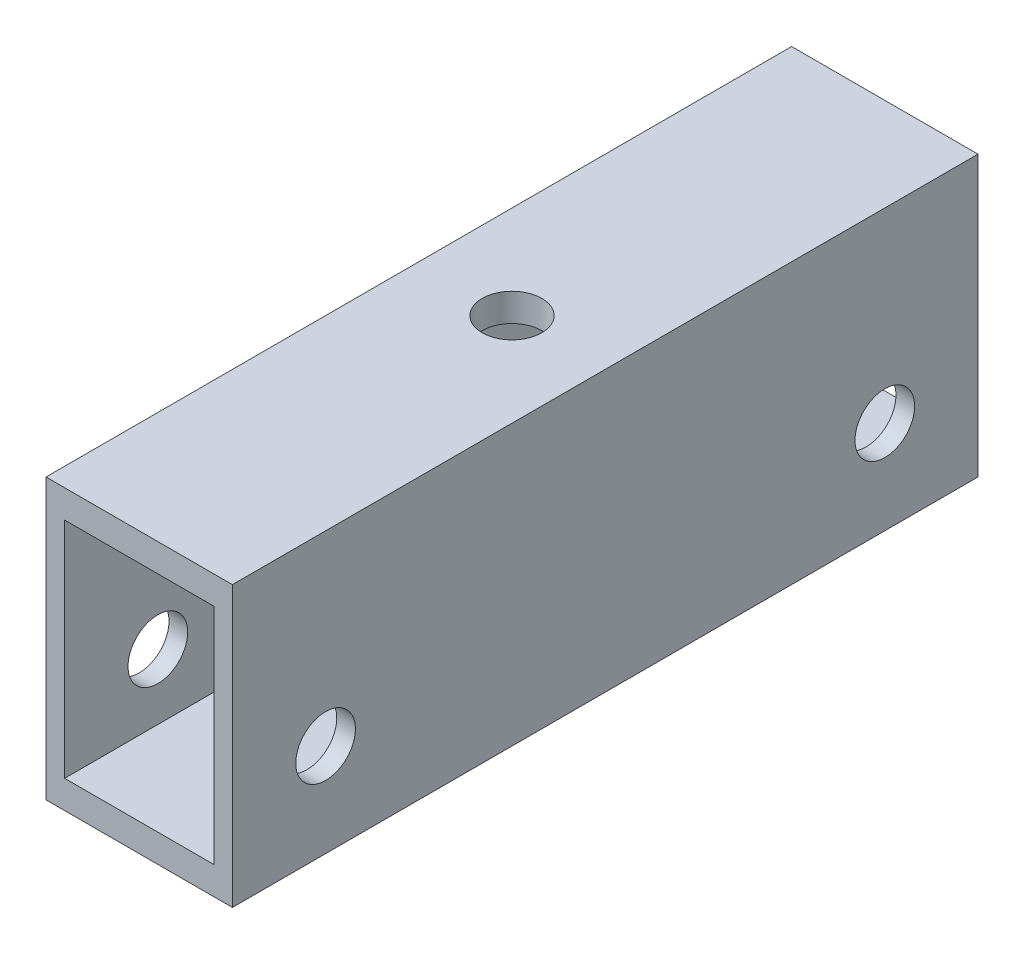
ISO-10303-21;
HEADER;
FILE_DESCRIPTION(('STEP AP214'),'2;1');
FILE_NAME('part.step','',(''),(''),'','','');
FILE_SCHEMA(('AUTOMOTIVE_DESIGN { 1 0 10303 214 1 1 1 1 }'));
ENDSEC;
DATA;
#1=APPLICATION_CONTEXT('core data for automotive mechanical design processes');
#2=APPLICATION_PROTOCOL_DEFINITION('international standard','automotive_design',2000,#1);
#3=PRODUCT_CONTEXT('',#1,'mechanical');
#4=PRODUCT('Part','Part','',(#3));
#5=PRODUCT_RELATED_PRODUCT_CATEGORY('part','',(#4));
#6=PRODUCT_DEFINITION_FORMATION('','',#4);
#7=PRODUCT_DEFINITION_CONTEXT('part definition',#1,'design');
#8=PRODUCT_DEFINITION('design','',#6,#7);
#9=PRODUCT_DEFINITION_SHAPE('','',#8);
#10=(LENGTH_UNIT() NAMED_UNIT(*) SI_UNIT(.MILLI.,.METRE.));
#11=(NAMED_UNIT(*) PLANE_ANGLE_UNIT() SI_UNIT($,.RADIAN.));
#12=(NAMED_UNIT(*) SI_UNIT($,.STERADIAN.) SOLID_ANGLE_UNIT());
#13=UNCERTAINTY_MEASURE_WITH_UNIT(LENGTH_MEASURE(1.E-05),#10,'distance_accuracy_value','');
#14=(GEOMETRIC_REPRESENTATION_CONTEXT(3) GLOBAL_UNCERTAINTY_ASSIGNED_CONTEXT((#13)) GLOBAL_UNIT_ASSIGNED_CONTEXT((#10,
#11,#12)) REPRESENTATION_CONTEXT('',''));
#15=CARTESIAN_POINT('',(0.,0.,0.));
#16=DIRECTION('',(0.,0.,1.));
#17=DIRECTION('',(1.,0.,0.));
#18=AXIS2_PLACEMENT_3D('',#15,#16,#17);
#19=CARTESIAN_POINT('',(0.,0.,40.));
#20=DIRECTION('',(0.,0.,1.));
#21=DIRECTION('',(1.,0.,0.));
#22=AXIS2_PLACEMENT_3D('',#19,#20,#21);
#23=PLANE('',#22);
#24=DIRECTION('',(0.,-1.,0.));
#25=VECTOR('',#24,1.);
#26=CARTESIAN_POINT('',(-5.,-7.5,40.));
#27=LINE('',#26,#25);
#28=CARTESIAN_POINT('',(-5.,7.5,40.));
#29=VERTEX_POINT('',#28);
#30=CARTESIAN_POINT('',(-5.,-7.5,40.));
#31=VERTEX_POINT('',#30);
#32=EDGE_CURVE('E138',#29,#31,#27,.T.);
#33=ORIENTED_EDGE('',*,*,#32,.T.);
#34=DIRECTION('',(1.,0.,0.));
#35=VECTOR('',#34,1.);
#36=CARTESIAN_POINT('',(5.,-7.5,40.));
#37=LINE('',#36,#35);
#38=CARTESIAN_POINT('',(5.,-7.5,40.));
#39=VERTEX_POINT('',#38);
#40=EDGE_CURVE('E141',#31,#39,#37,.T.);
#41=ORIENTED_EDGE('',*,*,#40,.T.);
#42=DIRECTION('',(0.,1.,0.));
#43=VECTOR('',#42,1.);
#44=CARTESIAN_POINT('',(5.,-7.5,40.));
#45=LINE('',#44,#43);
#46=CARTESIAN_POINT('',(5.,7.5,40.));
#47=VERTEX_POINT('',#46);
#48=EDGE_CURVE('E144',#39,#47,#45,.T.);
#49=ORIENTED_EDGE('',*,*,#48,.T.);
#50=DIRECTION('',(-1.,0.,0.));
#51=VECTOR('',#50,1.);
#52=CARTESIAN_POINT('',(5.,7.5,40.));
#53=LINE('',#52,#51);
#54=EDGE_CURVE('E146',#47,#29,#53,.T.);
#55=ORIENTED_EDGE('',*,*,#54,.T.);
#56=EDGE_LOOP('',(#33,#41,#49,#55));
#57=FACE_BOUND('',#56,.T.);
#58=DIRECTION('',(1.,0.,0.));
#59=VECTOR('',#58,1.);
#60=CARTESIAN_POINT('',(4.,-6.00000000000001,40.));
#61=LINE('',#60,#59);
#62=CARTESIAN_POINT('',(-4.,-6.00000000000001,40.));
#63=VERTEX_POINT('',#62);
#64=CARTESIAN_POINT('',(4.,-6.00000000000001,40.));
#65=VERTEX_POINT('',#64);
#66=EDGE_CURVE('E108',#63,#65,#61,.T.);
#67=ORIENTED_EDGE('',*,*,#66,.F.);
#68=DIRECTION('',(0.,-1.,0.));
#69=VECTOR('',#68,1.);
#70=CARTESIAN_POINT('',(-4.,-6.00000000000001,40.));
#71=LINE('',#70,#69);
#72=CARTESIAN_POINT('',(-4.,6.,40.));
#73=VERTEX_POINT('',#72);
#74=EDGE_CURVE('E100',#73,#63,#71,.T.);
#75=ORIENTED_EDGE('',*,*,#74,.F.);
#76=DIRECTION('',(-1.,0.,0.));
#77=VECTOR('',#76,1.);
#78=CARTESIAN_POINT('',(4.,6.,40.));
#79=LINE('',#78,#77);
#80=CARTESIAN_POINT('',(4.,6.,40.));
#81=VERTEX_POINT('',#80);
#82=EDGE_CURVE('E122',#81,#73,#79,.T.);
#83=ORIENTED_EDGE('',*,*,#82,.F.);
#84=DIRECTION('',(0.,1.,0.));
#85=VECTOR('',#84,1.);
#86=CARTESIAN_POINT('',(4.,-6.00000000000001,40.));
#87=LINE('',#86,#85);
#88=EDGE_CURVE('E120',#65,#81,#87,.T.);
#89=ORIENTED_EDGE('',*,*,#88,.F.);
#90=EDGE_LOOP('',(#67,#75,#83,#89));
#91=FACE_BOUND('',#90,.T.);
#92=ADVANCED_FACE('F33',(#57,#91),#23,.T.);
#93=CARTESIAN_POINT('',(0.,0.,0.));
#94=DIRECTION('',(0.,0.,1.));
#95=DIRECTION('',(1.,0.,0.));
#96=AXIS2_PLACEMENT_3D('',#93,#94,#95);
#97=PLANE('',#96);
#98=DIRECTION('',(0.,-1.,0.));
#99=VECTOR('',#98,1.);
#100=CARTESIAN_POINT('',(-5.,-7.5,0.));
#101=LINE('',#100,#99);
#102=CARTESIAN_POINT('',(-5.,7.5,0.));
#103=VERTEX_POINT('',#102);
#104=CARTESIAN_POINT('',(-5.,-7.5,0.));
#105=VERTEX_POINT('',#104);
#106=EDGE_CURVE('E116',#103,#105,#101,.T.);
#107=ORIENTED_EDGE('',*,*,#106,.F.);
#108=DIRECTION('',(-1.,0.,0.));
#109=VECTOR('',#108,1.);
#110=CARTESIAN_POINT('',(5.,7.5,0.));
#111=LINE('',#110,#109);
#112=CARTESIAN_POINT('',(5.,7.5,0.));
#113=VERTEX_POINT('',#112);
#114=EDGE_CURVE('E142',#113,#103,#111,.T.);
#115=ORIENTED_EDGE('',*,*,#114,.F.);
#116=DIRECTION('',(0.,1.,0.));
#117=VECTOR('',#116,1.);
#118=CARTESIAN_POINT('',(5.,-7.5,0.));
#119=LINE('',#118,#117);
#120=CARTESIAN_POINT('',(5.,-7.5,0.));
#121=VERTEX_POINT('',#120);
#122=EDGE_CURVE('E153',#121,#113,#119,.T.);
#123=ORIENTED_EDGE('',*,*,#122,.F.);
#124=DIRECTION('',(1.,0.,0.));
#125=VECTOR('',#124,1.);
#126=CARTESIAN_POINT('',(5.,-7.5,0.));
#127=LINE('',#126,#125);
#128=EDGE_CURVE('E151',#105,#121,#127,.T.);
#129=ORIENTED_EDGE('',*,*,#128,.F.);
#130=EDGE_LOOP('',(#107,#115,#123,#129));
#131=FACE_BOUND('',#130,.T.);
#132=DIRECTION('',(0.,-1.,0.));
#133=VECTOR('',#132,1.);
#134=CARTESIAN_POINT('',(-4.,-6.00000000000001,0.));
#135=LINE('',#134,#133);
#136=CARTESIAN_POINT('',(-4.,6.,0.));
#137=VERTEX_POINT('',#136);
#138=CARTESIAN_POINT('',(-4.,-6.00000000000001,0.));
#139=VERTEX_POINT('',#138);
#140=EDGE_CURVE('E58',#137,#139,#135,.T.);
#141=ORIENTED_EDGE('',*,*,#140,.T.);
#142=DIRECTION('',(1.,0.,0.));
#143=VECTOR('',#142,1.);
#144=CARTESIAN_POINT('',(4.,-6.00000000000001,0.));
#145=LINE('',#144,#143);
#146=CARTESIAN_POINT('',(4.,-6.00000000000001,0.));
#147=VERTEX_POINT('',#146);
#148=EDGE_CURVE('E115',#139,#147,#145,.T.);
#149=ORIENTED_EDGE('',*,*,#148,.T.);
#150=DIRECTION('',(0.,1.,0.));
#151=VECTOR('',#150,1.);
#152=CARTESIAN_POINT('',(4.,-6.00000000000001,0.));
#153=LINE('',#152,#151);
#154=CARTESIAN_POINT('',(4.,6.,0.));
#155=VERTEX_POINT('',#154);
#156=EDGE_CURVE('E130',#147,#155,#153,.T.);
#157=ORIENTED_EDGE('',*,*,#156,.T.);
#158=DIRECTION('',(-1.,0.,0.));
#159=VECTOR('',#158,1.);
#160=CARTESIAN_POINT('',(4.,6.,0.));
#161=LINE('',#160,#159);
#162=EDGE_CURVE('E109',#155,#137,#161,.T.);
#163=ORIENTED_EDGE('',*,*,#162,.T.);
#164=EDGE_LOOP('',(#141,#149,#157,#163));
#165=FACE_BOUND('',#164,.T.);
#166=ADVANCED_FACE('F215',(#131,#165),#97,.F.);
#167=CARTESIAN_POINT('',(-5.,-7.5,40.));
#168=DIRECTION('',(1.,0.,0.));
#169=DIRECTION('',(0.,0.,-1.));
#170=AXIS2_PLACEMENT_3D('',#167,#168,#169);
#171=PLANE('',#170);
#172=CARTESIAN_POINT('',(-5.,-2.5,35.));
#173=DIRECTION('',(1.,0.,0.));
#174=DIRECTION('',(0.,1.,0.));
#175=AXIS2_PLACEMENT_3D('',#172,#173,#174);
#176=CIRCLE('',#175,1.60000000000001);
#177=CARTESIAN_POINT('',(-5.,-0.899999999999996,35.));
#178=VERTEX_POINT('',#177);
#179=EDGE_CURVE('E169',#178,#178,#176,.T.);
#180=ORIENTED_EDGE('',*,*,#179,.T.);
#181=EDGE_LOOP('',(#180));
#182=FACE_BOUND('',#181,.T.);
#183=CARTESIAN_POINT('',(-5.,-2.5,5.));
#184=DIRECTION('',(1.,0.,0.));
#185=DIRECTION('',(0.,1.,0.));
#186=AXIS2_PLACEMENT_3D('',#183,#184,#185);
#187=CIRCLE('',#186,1.6);
#188=CARTESIAN_POINT('',(-5.,-0.9,5.));
#189=VERTEX_POINT('',#188);
#190=EDGE_CURVE('E180',#189,#189,#187,.T.);
#191=ORIENTED_EDGE('',*,*,#190,.T.);
#192=EDGE_LOOP('',(#191));
#193=FACE_BOUND('',#192,.T.);
#194=ORIENTED_EDGE('',*,*,#106,.T.);
#195=DIRECTION('',(0.,0.,-1.));
#196=VECTOR('',#195,1.);
#197=CARTESIAN_POINT('',(-5.,-7.5,40.));
#198=LINE('',#197,#196);
#199=EDGE_CURVE('E11',#31,#105,#198,.T.);
#200=ORIENTED_EDGE('',*,*,#199,.F.);
#201=ORIENTED_EDGE('',*,*,#32,.F.);
#202=DIRECTION('',(0.,0.,-1.));
#203=VECTOR('',#202,1.);
#204=CARTESIAN_POINT('',(-5.,7.5,40.));
#205=LINE('',#204,#203);
#206=EDGE_CURVE('E148',#29,#103,#205,.T.);
#207=ORIENTED_EDGE('',*,*,#206,.T.);
#208=EDGE_LOOP('',(#194,#200,#201,#207));
#209=FACE_BOUND('',#208,.T.);
#210=ADVANCED_FACE('F35',(#182,#193,#209),#171,.F.);
#211=CARTESIAN_POINT('',(5.,-7.5,40.));
#212=DIRECTION('',(0.,1.,0.));
#213=DIRECTION('',(-1.,0.,0.));
#214=AXIS2_PLACEMENT_3D('',#211,#212,#213);
#215=PLANE('',#214);
#216=CARTESIAN_POINT('',(0.,-7.5,20.));
#217=DIRECTION('',(0.,1.,0.));
#218=DIRECTION('',(0.,0.,1.));
#219=AXIS2_PLACEMENT_3D('',#216,#217,#218);
#220=CIRCLE('',#219,1.6);
#221=CARTESIAN_POINT('',(0.,-7.5,21.6));
#222=VERTEX_POINT('',#221);
#223=EDGE_CURVE('E165',#222,#222,#220,.T.);
#224=ORIENTED_EDGE('',*,*,#223,.T.);
#225=EDGE_LOOP('',(#224));
#226=FACE_BOUND('',#225,.T.);
#227=ORIENTED_EDGE('',*,*,#128,.T.);
#228=DIRECTION('',(0.,0.,-1.));
#229=VECTOR('',#228,1.);
#230=CARTESIAN_POINT('',(5.,-7.5,40.));
#231=LINE('',#230,#229);
#232=EDGE_CURVE('E42',#39,#121,#231,.T.);
#233=ORIENTED_EDGE('',*,*,#232,.F.);
#234=ORIENTED_EDGE('',*,*,#40,.F.);
#235=ORIENTED_EDGE('',*,*,#199,.T.);
#236=EDGE_LOOP('',(#227,#233,#234,#235));
#237=FACE_BOUND('',#236,.T.);
#238=ADVANCED_FACE('F229',(#226,#237),#215,.F.);
#239=CARTESIAN_POINT('',(5.,-7.5,40.));
#240=DIRECTION('',(-1.,0.,0.));
#241=DIRECTION('',(0.,-1.,0.));
#242=AXIS2_PLACEMENT_3D('',#239,#240,#241);
#243=PLANE('',#242);
#244=CARTESIAN_POINT('',(5.,-2.5,35.));
#245=DIRECTION('',(1.,0.,0.));
#246=DIRECTION('',(0.,1.,0.));
#247=AXIS2_PLACEMENT_3D('',#244,#245,#246);
#248=CIRCLE('',#247,1.60000000000001);
#249=CARTESIAN_POINT('',(5.,-0.899999999999996,35.));
#250=VERTEX_POINT('',#249);
#251=EDGE_CURVE('E175',#250,#250,#248,.T.);
#252=ORIENTED_EDGE('',*,*,#251,.F.);
#253=EDGE_LOOP('',(#252));
#254=FACE_BOUND('',#253,.T.);
#255=CARTESIAN_POINT('',(5.,-2.5,5.));
#256=DIRECTION('',(1.,0.,0.));
#257=DIRECTION('',(0.,1.,0.));
#258=AXIS2_PLACEMENT_3D('',#255,#256,#257);
#259=CIRCLE('',#258,1.6);
#260=CARTESIAN_POINT('',(5.,-0.899999999999999,5.));
#261=VERTEX_POINT('',#260);
#262=EDGE_CURVE('E185',#261,#261,#259,.T.);
#263=ORIENTED_EDGE('',*,*,#262,.F.);
#264=EDGE_LOOP('',(#263));
#265=FACE_BOUND('',#264,.T.);
#266=ORIENTED_EDGE('',*,*,#122,.T.);
#267=DIRECTION('',(0.,0.,-1.));
#268=VECTOR('',#267,1.);
#269=CARTESIAN_POINT('',(5.,7.5,40.));
#270=LINE('',#269,#268);
#271=EDGE_CURVE('E158',#47,#113,#270,.T.);
#272=ORIENTED_EDGE('',*,*,#271,.F.);
#273=ORIENTED_EDGE('',*,*,#48,.F.);
#274=ORIENTED_EDGE('',*,*,#232,.T.);
#275=EDGE_LOOP('',(#266,#272,#273,#274));
#276=FACE_BOUND('',#275,.T.);
#277=ADVANCED_FACE('F226',(#254,#265,#276),#243,.F.);
#278=CARTESIAN_POINT('',(5.,7.5,40.));
#279=DIRECTION('',(0.,-1.,0.));
#280=DIRECTION('',(0.,0.,-1.));
#281=AXIS2_PLACEMENT_3D('',#278,#279,#280);
#282=PLANE('',#281);
#283=CARTESIAN_POINT('',(0.,7.5,20.));
#284=DIRECTION('',(0.,1.,0.));
#285=DIRECTION('',(0.,0.,1.));
#286=AXIS2_PLACEMENT_3D('',#283,#284,#285);
#287=CIRCLE('',#286,1.6);
#288=CARTESIAN_POINT('',(0.,7.5,21.6));
#289=VERTEX_POINT('',#288);
#290=EDGE_CURVE('E191',#289,#289,#287,.T.);
#291=ORIENTED_EDGE('',*,*,#290,.F.);
#292=EDGE_LOOP('',(#291));
#293=FACE_BOUND('',#292,.T.);
#294=ORIENTED_EDGE('',*,*,#114,.T.);
#295=ORIENTED_EDGE('',*,*,#206,.F.);
#296=ORIENTED_EDGE('',*,*,#54,.F.);
#297=ORIENTED_EDGE('',*,*,#271,.T.);
#298=EDGE_LOOP('',(#294,#295,#296,#297));
#299=FACE_BOUND('',#298,.T.);
#300=ADVANCED_FACE('F211',(#293,#299),#282,.F.);
#301=CARTESIAN_POINT('',(-4.,-6.00000000000001,40.));
#302=DIRECTION('',(1.,0.,0.));
#303=DIRECTION('',(0.,0.,-1.));
#304=AXIS2_PLACEMENT_3D('',#301,#302,#303);
#305=PLANE('',#304);
#306=CARTESIAN_POINT('',(-4.,-2.5,35.));
#307=DIRECTION('',(1.,0.,0.));
#308=DIRECTION('',(0.,0.,-1.));
#309=AXIS2_PLACEMENT_3D('',#306,#307,#308);
#310=CIRCLE('',#309,1.60000000000001);
#311=CARTESIAN_POINT('',(-4.,-2.5,33.4));
#312=VERTEX_POINT('',#311);
#313=EDGE_CURVE('E188',#312,#312,#310,.T.);
#314=ORIENTED_EDGE('',*,*,#313,.F.);
#315=EDGE_LOOP('',(#314));
#316=FACE_BOUND('',#315,.T.);
#317=CARTESIAN_POINT('',(-4.,-2.5,5.));
#318=DIRECTION('',(1.,0.,0.));
#319=DIRECTION('',(0.,0.,-1.));
#320=AXIS2_PLACEMENT_3D('',#317,#318,#319);
#321=CIRCLE('',#320,1.6);
#322=CARTESIAN_POINT('',(-4.,-2.5,3.4));
#323=VERTEX_POINT('',#322);
#324=EDGE_CURVE('E168',#323,#323,#321,.T.);
#325=ORIENTED_EDGE('',*,*,#324,.F.);
#326=EDGE_LOOP('',(#325));
#327=FACE_BOUND('',#326,.T.);
#328=ORIENTED_EDGE('',*,*,#140,.F.);
#329=DIRECTION('',(0.,0.,-1.));
#330=VECTOR('',#329,1.);
#331=CARTESIAN_POINT('',(-4.,6.,40.));
#332=LINE('',#331,#330);
#333=EDGE_CURVE('E104',#73,#137,#332,.T.);
#334=ORIENTED_EDGE('',*,*,#333,.F.);
#335=ORIENTED_EDGE('',*,*,#74,.T.);
#336=DIRECTION('',(0.,0.,-1.));
#337=VECTOR('',#336,1.);
#338=CARTESIAN_POINT('',(-4.,-6.00000000000001,40.));
#339=LINE('',#338,#337);
#340=EDGE_CURVE('E103',#63,#139,#339,.T.);
#341=ORIENTED_EDGE('',*,*,#340,.T.);
#342=EDGE_LOOP('',(#328,#334,#335,#341));
#343=FACE_BOUND('',#342,.T.);
#344=ADVANCED_FACE('F102',(#316,#327,#343),#305,.T.);
#345=CARTESIAN_POINT('',(4.,-6.00000000000001,40.));
#346=DIRECTION('',(0.,1.,0.));
#347=DIRECTION('',(0.,0.,1.));
#348=AXIS2_PLACEMENT_3D('',#345,#346,#347);
#349=PLANE('',#348);
#350=CARTESIAN_POINT('',(0.,-6.00000000000001,20.));
#351=DIRECTION('',(0.,1.,0.));
#352=DIRECTION('',(0.,0.,1.));
#353=AXIS2_PLACEMENT_3D('',#350,#351,#352);
#354=CIRCLE('',#353,1.6);
#355=CARTESIAN_POINT('',(0.,-6.00000000000001,21.6));
#356=VERTEX_POINT('',#355);
#357=EDGE_CURVE('E128',#356,#356,#354,.T.);
#358=ORIENTED_EDGE('',*,*,#357,.F.);
#359=EDGE_LOOP('',(#358));
#360=FACE_BOUND('',#359,.T.);
#361=ORIENTED_EDGE('',*,*,#148,.F.);
#362=ORIENTED_EDGE('',*,*,#340,.F.);
#363=ORIENTED_EDGE('',*,*,#66,.T.);
#364=DIRECTION('',(0.,0.,-1.));
#365=VECTOR('',#364,1.);
#366=CARTESIAN_POINT('',(4.,-6.00000000000001,40.));
#367=LINE('',#366,#365);
#368=EDGE_CURVE('E117',#65,#147,#367,.T.);
#369=ORIENTED_EDGE('',*,*,#368,.T.);
#370=EDGE_LOOP('',(#361,#362,#363,#369));
#371=FACE_BOUND('',#370,.T.);
#372=ADVANCED_FACE('F112',(#360,#371),#349,.T.);
#373=CARTESIAN_POINT('',(4.,-6.00000000000001,40.));
#374=DIRECTION('',(-1.,0.,0.));
#375=DIRECTION('',(0.,0.,1.));
#376=AXIS2_PLACEMENT_3D('',#373,#374,#375);
#377=PLANE('',#376);
#378=CARTESIAN_POINT('',(4.,-2.5,35.));
#379=DIRECTION('',(-1.,0.,0.));
#380=DIRECTION('',(0.,0.,1.));
#381=AXIS2_PLACEMENT_3D('',#378,#379,#380);
#382=CIRCLE('',#381,1.60000000000001);
#383=CARTESIAN_POINT('',(4.,-2.5,36.6));
#384=VERTEX_POINT('',#383);
#385=EDGE_CURVE('E37',#384,#384,#382,.T.);
#386=ORIENTED_EDGE('',*,*,#385,.F.);
#387=EDGE_LOOP('',(#386));
#388=FACE_BOUND('',#387,.T.);
#389=CARTESIAN_POINT('',(4.,-2.5,5.));
#390=DIRECTION('',(-1.,0.,0.));
#391=DIRECTION('',(0.,0.,1.));
#392=AXIS2_PLACEMENT_3D('',#389,#390,#391);
#393=CIRCLE('',#392,1.6);
#394=CARTESIAN_POINT('',(4.,-2.5,6.6));
#395=VERTEX_POINT('',#394);
#396=EDGE_CURVE('E166',#395,#395,#393,.T.);
#397=ORIENTED_EDGE('',*,*,#396,.F.);
#398=EDGE_LOOP('',(#397));
#399=FACE_BOUND('',#398,.T.);
#400=ORIENTED_EDGE('',*,*,#156,.F.);
#401=ORIENTED_EDGE('',*,*,#368,.F.);
#402=ORIENTED_EDGE('',*,*,#88,.T.);
#403=DIRECTION('',(0.,0.,-1.));
#404=VECTOR('',#403,1.);
#405=CARTESIAN_POINT('',(4.,6.,40.));
#406=LINE('',#405,#404);
#407=EDGE_CURVE('E50',#81,#155,#406,.T.);
#408=ORIENTED_EDGE('',*,*,#407,.T.);
#409=EDGE_LOOP('',(#400,#401,#402,#408));
#410=FACE_BOUND('',#409,.T.);
#411=ADVANCED_FACE('F202',(#388,#399,#410),#377,.T.);
#412=CARTESIAN_POINT('',(4.,6.,40.));
#413=DIRECTION('',(0.,-1.,0.));
#414=DIRECTION('',(0.,0.,-1.));
#415=AXIS2_PLACEMENT_3D('',#412,#413,#414);
#416=PLANE('',#415);
#417=CARTESIAN_POINT('',(0.,6.,20.));
#418=DIRECTION('',(0.,-1.,0.));
#419=DIRECTION('',(0.,0.,-1.));
#420=AXIS2_PLACEMENT_3D('',#417,#418,#419);
#421=CIRCLE('',#420,1.6);
#422=CARTESIAN_POINT('',(0.,6.,18.4));
#423=VERTEX_POINT('',#422);
#424=EDGE_CURVE('E163',#423,#423,#421,.T.);
#425=ORIENTED_EDGE('',*,*,#424,.F.);
#426=EDGE_LOOP('',(#425));
#427=FACE_BOUND('',#426,.T.);
#428=ORIENTED_EDGE('',*,*,#162,.F.);
#429=ORIENTED_EDGE('',*,*,#407,.F.);
#430=ORIENTED_EDGE('',*,*,#82,.T.);
#431=ORIENTED_EDGE('',*,*,#333,.T.);
#432=EDGE_LOOP('',(#428,#429,#430,#431));
#433=FACE_BOUND('',#432,.T.);
#434=ADVANCED_FACE('F208',(#427,#433),#416,.T.);
#435=CARTESIAN_POINT('',(0.,-7.5,20.));
#436=DIRECTION('',(0.,1.,0.));
#437=DIRECTION('',(0.,0.,1.));
#438=AXIS2_PLACEMENT_3D('',#435,#436,#437);
#439=CYLINDRICAL_SURFACE('',#438,1.6);
#440=ORIENTED_EDGE('',*,*,#424,.T.);
#441=EDGE_LOOP('',(#440));
#442=FACE_BOUND('',#441,.T.);
#443=ORIENTED_EDGE('',*,*,#290,.T.);
#444=EDGE_LOOP('',(#443));
#445=FACE_BOUND('',#444,.T.);
#446=ADVANCED_FACE('F254',(#442,#445),#439,.F.);
#447=ORIENTED_EDGE('',*,*,#357,.T.);
#448=EDGE_LOOP('',(#447));
#449=FACE_BOUND('',#448,.T.);
#450=ORIENTED_EDGE('',*,*,#223,.F.);
#451=EDGE_LOOP('',(#450));
#452=FACE_BOUND('',#451,.T.);
#453=ADVANCED_FACE('F198',(#449,#452),#439,.F.);
#454=CARTESIAN_POINT('',(-5.,-2.5,5.));
#455=DIRECTION('',(1.,0.,0.));
#456=DIRECTION('',(0.,1.,0.));
#457=AXIS2_PLACEMENT_3D('',#454,#455,#456);
#458=CYLINDRICAL_SURFACE('',#457,1.6);
#459=ORIENTED_EDGE('',*,*,#396,.T.);
#460=EDGE_LOOP('',(#459));
#461=FACE_BOUND('',#460,.T.);
#462=ORIENTED_EDGE('',*,*,#262,.T.);
#463=EDGE_LOOP('',(#462));
#464=FACE_BOUND('',#463,.T.);
#465=ADVANCED_FACE('F264',(#461,#464),#458,.F.);
#466=CARTESIAN_POINT('',(-5.,-2.5,35.));
#467=DIRECTION('',(1.,0.,0.));
#468=DIRECTION('',(0.,1.,0.));
#469=AXIS2_PLACEMENT_3D('',#466,#467,#468);
#470=CYLINDRICAL_SURFACE('',#469,1.60000000000001);
#471=ORIENTED_EDGE('',*,*,#385,.T.);
#472=EDGE_LOOP('',(#471));
#473=FACE_BOUND('',#472,.T.);
#474=ORIENTED_EDGE('',*,*,#251,.T.);
#475=EDGE_LOOP('',(#474));
#476=FACE_BOUND('',#475,.T.);
#477=ADVANCED_FACE('F267',(#473,#476),#470,.F.);
#478=ORIENTED_EDGE('',*,*,#324,.T.);
#479=EDGE_LOOP('',(#478));
#480=FACE_BOUND('',#479,.T.);
#481=ORIENTED_EDGE('',*,*,#190,.F.);
#482=EDGE_LOOP('',(#481));
#483=FACE_BOUND('',#482,.T.);
#484=ADVANCED_FACE('F268',(#480,#483),#458,.F.);
#485=ORIENTED_EDGE('',*,*,#313,.T.);
#486=EDGE_LOOP('',(#485));
#487=FACE_BOUND('',#486,.T.);
#488=ORIENTED_EDGE('',*,*,#179,.F.);
#489=EDGE_LOOP('',(#488));
#490=FACE_BOUND('',#489,.T.);
#491=ADVANCED_FACE('F271',(#487,#490),#470,.F.);
#492=CLOSED_SHELL('',(#92,#166,#210,#238,#277,#300,#344,#372,#411,#434,#446,#453,#465,#477,#484,#491));
#493=MANIFOLD_SOLID_BREP('B2',#492);
#494=ADVANCED_BREP_SHAPE_REPRESENTATION('',(#18,#493),#14);
#495=SHAPE_DEFINITION_REPRESENTATION(#9,#494);
ENDSEC;
END-ISO-10303-21;
